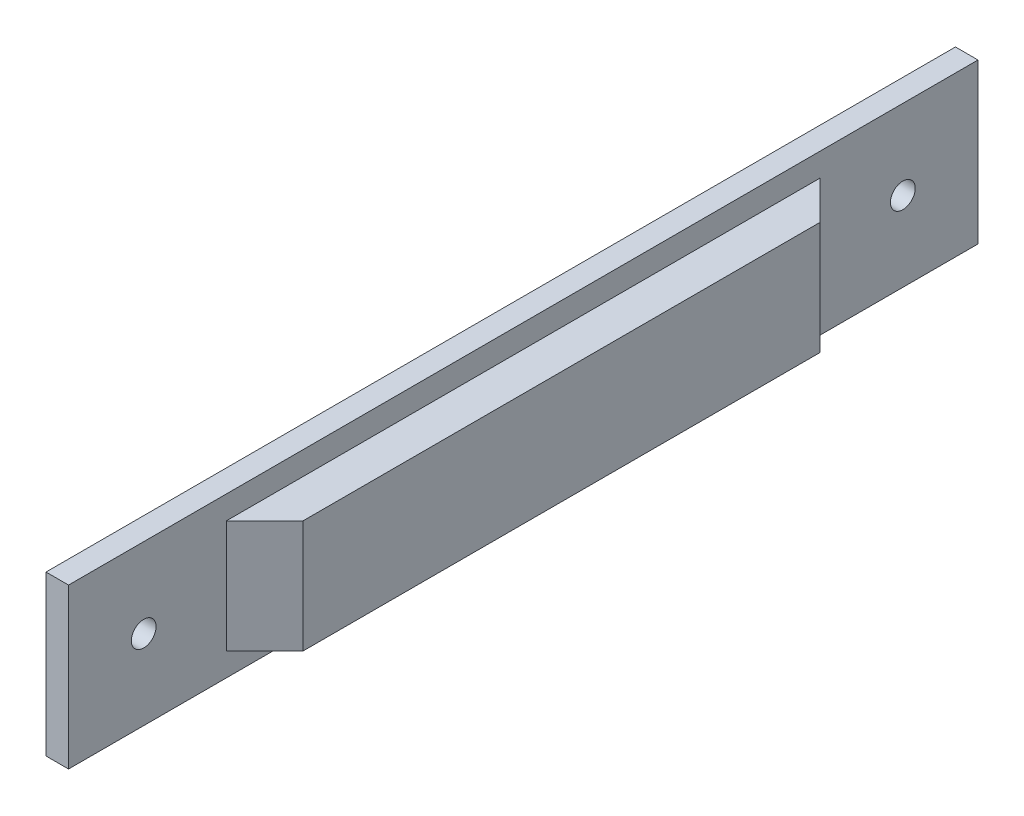
ISO-10303-21;
HEADER;
FILE_DESCRIPTION(('STEP AP214'),'2;1');
FILE_NAME('part.step','',(''),(''),'','','');
FILE_SCHEMA(('AUTOMOTIVE_DESIGN { 1 0 10303 214 1 1 1 1 }'));
ENDSEC;
DATA;
#1=APPLICATION_CONTEXT('core data for automotive mechanical design processes');
#2=APPLICATION_PROTOCOL_DEFINITION('international standard','automotive_design',2000,#1);
#3=PRODUCT_CONTEXT('',#1,'mechanical');
#4=PRODUCT('Part','Part','',(#3));
#5=PRODUCT_RELATED_PRODUCT_CATEGORY('part','',(#4));
#6=PRODUCT_DEFINITION_FORMATION('','',#4);
#7=PRODUCT_DEFINITION_CONTEXT('part definition',#1,'design');
#8=PRODUCT_DEFINITION('design','',#6,#7);
#9=PRODUCT_DEFINITION_SHAPE('','',#8);
#10=(LENGTH_UNIT() NAMED_UNIT(*) SI_UNIT(.MILLI.,.METRE.));
#11=(NAMED_UNIT(*) PLANE_ANGLE_UNIT() SI_UNIT($,.RADIAN.));
#12=(NAMED_UNIT(*) SI_UNIT($,.STERADIAN.) SOLID_ANGLE_UNIT());
#13=UNCERTAINTY_MEASURE_WITH_UNIT(LENGTH_MEASURE(1.E-05),#10,'distance_accuracy_value','');
#14=(GEOMETRIC_REPRESENTATION_CONTEXT(3) GLOBAL_UNCERTAINTY_ASSIGNED_CONTEXT((#13)) GLOBAL_UNIT_ASSIGNED_CONTEXT((#10,
#11,#12)) REPRESENTATION_CONTEXT('',''));
#15=CARTESIAN_POINT('',(0.,0.,0.));
#16=DIRECTION('',(0.,0.,1.));
#17=DIRECTION('',(1.,0.,0.));
#18=AXIS2_PLACEMENT_3D('',#15,#16,#17);
#19=CARTESIAN_POINT('',(0.,0.,121.));
#20=DIRECTION('',(1.,0.,0.));
#21=DIRECTION('',(0.,0.,-1.));
#22=AXIS2_PLACEMENT_3D('',#19,#20,#21);
#23=PLANE('',#22);
#24=CARTESIAN_POINT('',(0.,7.6,10.));
#25=DIRECTION('',(1.,0.,0.));
#26=DIRECTION('',(0.,0.,-1.));
#27=AXIS2_PLACEMENT_3D('',#24,#25,#26);
#28=CIRCLE('',#27,1.65);
#29=CARTESIAN_POINT('',(0.,7.6,11.65));
#30=VERTEX_POINT('',#29);
#31=EDGE_CURVE('E167',#30,#30,#28,.T.);
#32=ORIENTED_EDGE('',*,*,#31,.F.);
#33=EDGE_LOOP('',(#32));
#34=FACE_BOUND('',#33,.T.);
#35=CARTESIAN_POINT('',(0.,7.6,111.));
#36=DIRECTION('',(1.,0.,0.));
#37=DIRECTION('',(0.,0.,-1.));
#38=AXIS2_PLACEMENT_3D('',#35,#36,#37);
#39=CIRCLE('',#38,1.64999999999999);
#40=CARTESIAN_POINT('',(0.,7.6,112.65));
#41=VERTEX_POINT('',#40);
#42=EDGE_CURVE('E162',#41,#41,#39,.T.);
#43=ORIENTED_EDGE('',*,*,#42,.F.);
#44=EDGE_LOOP('',(#43));
#45=FACE_BOUND('',#44,.T.);
#46=DIRECTION('',(0.,-1.,0.));
#47=VECTOR('',#46,1.);
#48=CARTESIAN_POINT('',(0.,0.,0.));
#49=LINE('',#48,#47);
#50=CARTESIAN_POINT('',(0.,18.2,0.));
#51=VERTEX_POINT('',#50);
#52=CARTESIAN_POINT('',(0.,-3.,0.));
#53=VERTEX_POINT('',#52);
#54=EDGE_CURVE('E170',#51,#53,#49,.T.);
#55=ORIENTED_EDGE('',*,*,#54,.F.);
#56=DIRECTION('',(0.,0.,1.));
#57=VECTOR('',#56,1.);
#58=CARTESIAN_POINT('',(0.,18.2,121.));
#59=LINE('',#58,#57);
#60=CARTESIAN_POINT('',(0.,18.2,121.));
#61=VERTEX_POINT('',#60);
#62=EDGE_CURVE('E155',#51,#61,#59,.T.);
#63=ORIENTED_EDGE('',*,*,#62,.T.);
#64=DIRECTION('',(0.,-1.,0.));
#65=VECTOR('',#64,1.);
#66=CARTESIAN_POINT('',(0.,0.,121.));
#67=LINE('',#66,#65);
#68=CARTESIAN_POINT('',(0.,-3.,121.));
#69=VERTEX_POINT('',#68);
#70=EDGE_CURVE('E171',#61,#69,#67,.T.);
#71=ORIENTED_EDGE('',*,*,#70,.T.);
#72=DIRECTION('',(0.,0.,-1.));
#73=VECTOR('',#72,1.);
#74=CARTESIAN_POINT('',(0.,-3.,121.));
#75=LINE('',#74,#73);
#76=EDGE_CURVE('E151',#69,#53,#75,.T.);
#77=ORIENTED_EDGE('',*,*,#76,.T.);
#78=EDGE_LOOP('',(#55,#63,#71,#77));
#79=FACE_BOUND('',#78,.T.);
#80=DIRECTION('',(0.,0.,1.));
#81=VECTOR('',#80,1.);
#82=CARTESIAN_POINT('',(0.,15.1,94.9));
#83=LINE('',#82,#81);
#84=CARTESIAN_POINT('',(0.,15.1,21.));
#85=VERTEX_POINT('',#84);
#86=CARTESIAN_POINT('',(0.,15.1,100.));
#87=VERTEX_POINT('',#86);
#88=EDGE_CURVE('E78',#85,#87,#83,.T.);
#89=ORIENTED_EDGE('',*,*,#88,.F.);
#90=DIRECTION('',(0.,-1.,0.));
#91=VECTOR('',#90,1.);
#92=CARTESIAN_POINT('',(0.,0.,21.));
#93=LINE('',#92,#91);
#94=CARTESIAN_POINT('',(0.,0.100000000000025,21.));
#95=VERTEX_POINT('',#94);
#96=EDGE_CURVE('E197',#85,#95,#93,.T.);
#97=ORIENTED_EDGE('',*,*,#96,.T.);
#98=DIRECTION('',(0.,0.,-1.));
#99=VECTOR('',#98,1.);
#100=CARTESIAN_POINT('',(0.,0.0999999999999803,94.9));
#101=LINE('',#100,#99);
#102=CARTESIAN_POINT('',(0.,0.0999999999999772,100.));
#103=VERTEX_POINT('',#102);
#104=EDGE_CURVE('E86',#103,#95,#101,.T.);
#105=ORIENTED_EDGE('',*,*,#104,.F.);
#106=DIRECTION('',(0.,1.,0.));
#107=VECTOR('',#106,1.);
#108=CARTESIAN_POINT('',(0.,0.,100.));
#109=LINE('',#108,#107);
#110=EDGE_CURVE('E131',#103,#87,#109,.T.);
#111=ORIENTED_EDGE('',*,*,#110,.T.);
#112=EDGE_LOOP('',(#89,#97,#105,#111));
#113=FACE_BOUND('',#112,.T.);
#114=ADVANCED_FACE('F62',(#34,#45,#79,#113),#23,.T.);
#115=CARTESIAN_POINT('',(0.,0.,121.));
#116=DIRECTION('',(0.,0.,1.));
#117=DIRECTION('',(1.,0.,0.));
#118=AXIS2_PLACEMENT_3D('',#115,#116,#117);
#119=PLANE('',#118);
#120=DIRECTION('',(1.,0.,0.));
#121=VECTOR('',#120,1.);
#122=CARTESIAN_POINT('',(0.,-3.,121.));
#123=LINE('',#122,#121);
#124=CARTESIAN_POINT('',(-3.,-3.,121.));
#125=VERTEX_POINT('',#124);
#126=EDGE_CURVE('E178',#125,#69,#123,.T.);
#127=ORIENTED_EDGE('',*,*,#126,.T.);
#128=ORIENTED_EDGE('',*,*,#70,.F.);
#129=DIRECTION('',(-1.,0.,0.));
#130=VECTOR('',#129,1.);
#131=CARTESIAN_POINT('',(0.,18.2,121.));
#132=LINE('',#131,#130);
#133=CARTESIAN_POINT('',(-3.,18.2,121.));
#134=VERTEX_POINT('',#133);
#135=EDGE_CURVE('E182',#61,#134,#132,.T.);
#136=ORIENTED_EDGE('',*,*,#135,.T.);
#137=DIRECTION('',(0.,-1.,0.));
#138=VECTOR('',#137,1.);
#139=CARTESIAN_POINT('',(-3.,0.,121.));
#140=LINE('',#139,#138);
#141=EDGE_CURVE('E175',#134,#125,#140,.T.);
#142=ORIENTED_EDGE('',*,*,#141,.T.);
#143=EDGE_LOOP('',(#127,#128,#136,#142));
#144=FACE_BOUND('',#143,.T.);
#145=ADVANCED_FACE('F207',(#144),#119,.T.);
#146=CARTESIAN_POINT('',(0.,0.,0.));
#147=DIRECTION('',(0.,0.,1.));
#148=DIRECTION('',(1.,0.,0.));
#149=AXIS2_PLACEMENT_3D('',#146,#147,#148);
#150=PLANE('',#149);
#151=ORIENTED_EDGE('',*,*,#54,.T.);
#152=DIRECTION('',(1.,0.,0.));
#153=VECTOR('',#152,1.);
#154=CARTESIAN_POINT('',(0.,-3.,0.));
#155=LINE('',#154,#153);
#156=CARTESIAN_POINT('',(-3.,-3.,0.));
#157=VERTEX_POINT('',#156);
#158=EDGE_CURVE('E187',#157,#53,#155,.T.);
#159=ORIENTED_EDGE('',*,*,#158,.F.);
#160=DIRECTION('',(0.,-1.,0.));
#161=VECTOR('',#160,1.);
#162=CARTESIAN_POINT('',(-3.,0.,0.));
#163=LINE('',#162,#161);
#164=CARTESIAN_POINT('',(-3.,18.2,0.));
#165=VERTEX_POINT('',#164);
#166=EDGE_CURVE('E173',#165,#157,#163,.T.);
#167=ORIENTED_EDGE('',*,*,#166,.F.);
#168=DIRECTION('',(-1.,0.,0.));
#169=VECTOR('',#168,1.);
#170=CARTESIAN_POINT('',(0.,18.2,0.));
#171=LINE('',#170,#169);
#172=EDGE_CURVE('E179',#51,#165,#171,.T.);
#173=ORIENTED_EDGE('',*,*,#172,.F.);
#174=EDGE_LOOP('',(#151,#159,#167,#173));
#175=FACE_BOUND('',#174,.T.);
#176=ADVANCED_FACE('F213',(#175),#150,.F.);
#177=CARTESIAN_POINT('',(0.,-3.,121.));
#178=DIRECTION('',(0.,1.,0.));
#179=DIRECTION('',(0.,0.,1.));
#180=AXIS2_PLACEMENT_3D('',#177,#178,#179);
#181=PLANE('',#180);
#182=ORIENTED_EDGE('',*,*,#76,.F.);
#183=ORIENTED_EDGE('',*,*,#126,.F.);
#184=DIRECTION('',(0.,0.,-1.));
#185=VECTOR('',#184,1.);
#186=CARTESIAN_POINT('',(-3.,-3.,121.));
#187=LINE('',#186,#185);
#188=EDGE_CURVE('E193',#125,#157,#187,.T.);
#189=ORIENTED_EDGE('',*,*,#188,.T.);
#190=ORIENTED_EDGE('',*,*,#158,.T.);
#191=EDGE_LOOP('',(#182,#183,#189,#190));
#192=FACE_BOUND('',#191,.T.);
#193=ADVANCED_FACE('F224',(#192),#181,.F.);
#194=CARTESIAN_POINT('',(0.,18.2,121.));
#195=DIRECTION('',(0.,-1.,0.));
#196=DIRECTION('',(0.,0.,-1.));
#197=AXIS2_PLACEMENT_3D('',#194,#195,#196);
#198=PLANE('',#197);
#199=ORIENTED_EDGE('',*,*,#62,.F.);
#200=ORIENTED_EDGE('',*,*,#172,.T.);
#201=DIRECTION('',(0.,0.,-1.));
#202=VECTOR('',#201,1.);
#203=CARTESIAN_POINT('',(-3.,18.2,121.));
#204=LINE('',#203,#202);
#205=EDGE_CURVE('E184',#134,#165,#204,.T.);
#206=ORIENTED_EDGE('',*,*,#205,.F.);
#207=ORIENTED_EDGE('',*,*,#135,.F.);
#208=EDGE_LOOP('',(#199,#200,#206,#207));
#209=FACE_BOUND('',#208,.T.);
#210=ADVANCED_FACE('F226',(#209),#198,.F.);
#211=CARTESIAN_POINT('',(-3.,0.,121.));
#212=DIRECTION('',(1.,0.,0.));
#213=DIRECTION('',(0.,0.,-1.));
#214=AXIS2_PLACEMENT_3D('',#211,#212,#213);
#215=PLANE('',#214);
#216=CARTESIAN_POINT('',(-3.,7.6,10.));
#217=DIRECTION('',(-1.,0.,0.));
#218=DIRECTION('',(0.,0.,1.));
#219=AXIS2_PLACEMENT_3D('',#216,#217,#218);
#220=CIRCLE('',#219,1.65);
#221=CARTESIAN_POINT('',(-3.,7.6,11.65));
#222=VERTEX_POINT('',#221);
#223=EDGE_CURVE('E159',#222,#222,#220,.T.);
#224=ORIENTED_EDGE('',*,*,#223,.F.);
#225=EDGE_LOOP('',(#224));
#226=FACE_BOUND('',#225,.T.);
#227=CARTESIAN_POINT('',(-3.,7.6,111.));
#228=DIRECTION('',(-1.,0.,0.));
#229=DIRECTION('',(0.,0.,1.));
#230=AXIS2_PLACEMENT_3D('',#227,#228,#229);
#231=CIRCLE('',#230,1.64999999999999);
#232=CARTESIAN_POINT('',(-3.,7.6,112.65));
#233=VERTEX_POINT('',#232);
#234=EDGE_CURVE('E158',#233,#233,#231,.T.);
#235=ORIENTED_EDGE('',*,*,#234,.F.);
#236=EDGE_LOOP('',(#235));
#237=FACE_BOUND('',#236,.T.);
#238=ORIENTED_EDGE('',*,*,#166,.T.);
#239=ORIENTED_EDGE('',*,*,#188,.F.);
#240=ORIENTED_EDGE('',*,*,#141,.F.);
#241=ORIENTED_EDGE('',*,*,#205,.T.);
#242=EDGE_LOOP('',(#238,#239,#240,#241));
#243=FACE_BOUND('',#242,.T.);
#244=ADVANCED_FACE('F229',(#226,#237,#243),#215,.F.);
#245=CARTESIAN_POINT('',(27.,7.6,111.));
#246=DIRECTION('',(-1.,0.,0.));
#247=DIRECTION('',(0.,0.,1.));
#248=AXIS2_PLACEMENT_3D('',#245,#246,#247);
#249=CYLINDRICAL_SURFACE('',#248,1.64999999999999);
#250=CARTESIAN_POINT('',(0.,7.6,112.65));
#251=CARTESIAN_POINT('',(-0.0312500000000035,7.6,112.65));
#252=CARTESIAN_POINT('',(-0.0625000000000035,7.6,112.65));
#253=CARTESIAN_POINT('',(-0.125000000000004,7.6,112.65));
#254=CARTESIAN_POINT('',(-0.156250000000004,7.6,112.65));
#255=CARTESIAN_POINT('',(-0.218750000000004,7.6,112.65));
#256=CARTESIAN_POINT('',(-0.250000000000004,7.6,112.65));
#257=CARTESIAN_POINT('',(-0.312500000000004,7.6,112.65));
#258=CARTESIAN_POINT('',(-0.343750000000004,7.6,112.65));
#259=CARTESIAN_POINT('',(-0.406250000000004,7.6,112.65));
#260=CARTESIAN_POINT('',(-0.437500000000004,7.6,112.65));
#261=CARTESIAN_POINT('',(-0.500000000000004,7.6,112.65));
#262=CARTESIAN_POINT('',(-0.531250000000004,7.6,112.65));
#263=CARTESIAN_POINT('',(-0.593750000000004,7.6,112.65));
#264=CARTESIAN_POINT('',(-0.625000000000004,7.6,112.65));
#265=CARTESIAN_POINT('',(-0.687500000000004,7.6,112.65));
#266=CARTESIAN_POINT('',(-0.718750000000004,7.6,112.65));
#267=CARTESIAN_POINT('',(-0.781250000000003,7.6,112.65));
#268=CARTESIAN_POINT('',(-0.812500000000002,7.6,112.65));
#269=CARTESIAN_POINT('',(-0.875000000000001,7.6,112.65));
#270=CARTESIAN_POINT('',(-0.906250000000001,7.6,112.65));
#271=CARTESIAN_POINT('',(-0.968750000000001,7.6,112.65));
#272=CARTESIAN_POINT('',(-1.,7.6,112.65));
#273=CARTESIAN_POINT('',(-1.0625,7.6,112.65));
#274=CARTESIAN_POINT('',(-1.09375,7.6,112.65));
#275=CARTESIAN_POINT('',(-1.15625,7.6,112.65));
#276=CARTESIAN_POINT('',(-1.1875,7.6,112.65));
#277=CARTESIAN_POINT('',(-1.25,7.6,112.65));
#278=CARTESIAN_POINT('',(-1.28125,7.6,112.65));
#279=CARTESIAN_POINT('',(-1.34375,7.6,112.65));
#280=CARTESIAN_POINT('',(-1.375,7.6,112.65));
#281=CARTESIAN_POINT('',(-1.4375,7.6,112.65));
#282=CARTESIAN_POINT('',(-1.46875,7.6,112.65));
#283=CARTESIAN_POINT('',(-1.53125,7.6,112.65));
#284=CARTESIAN_POINT('',(-1.5625,7.6,112.65));
#285=CARTESIAN_POINT('',(-1.625,7.6,112.65));
#286=CARTESIAN_POINT('',(-1.65625,7.6,112.65));
#287=CARTESIAN_POINT('',(-1.71875,7.6,112.65));
#288=CARTESIAN_POINT('',(-1.75,7.6,112.65));
#289=CARTESIAN_POINT('',(-1.8125,7.6,112.65));
#290=CARTESIAN_POINT('',(-1.84375,7.6,112.65));
#291=CARTESIAN_POINT('',(-1.90625,7.6,112.65));
#292=CARTESIAN_POINT('',(-1.9375,7.6,112.65));
#293=CARTESIAN_POINT('',(-2.,7.6,112.65));
#294=CARTESIAN_POINT('',(-2.03125,7.6,112.65));
#295=CARTESIAN_POINT('',(-2.09375,7.6,112.65));
#296=CARTESIAN_POINT('',(-2.125,7.6,112.65));
#297=CARTESIAN_POINT('',(-2.1875,7.6,112.65));
#298=CARTESIAN_POINT('',(-2.21875,7.6,112.65));
#299=CARTESIAN_POINT('',(-2.28125,7.6,112.65));
#300=CARTESIAN_POINT('',(-2.3125,7.6,112.65));
#301=CARTESIAN_POINT('',(-2.375,7.6,112.65));
#302=CARTESIAN_POINT('',(-2.40625,7.6,112.65));
#303=CARTESIAN_POINT('',(-2.46875,7.6,112.65));
#304=CARTESIAN_POINT('',(-2.5,7.6,112.65));
#305=CARTESIAN_POINT('',(-2.5625,7.6,112.65));
#306=CARTESIAN_POINT('',(-2.59375,7.6,112.65));
#307=CARTESIAN_POINT('',(-2.65625,7.6,112.65));
#308=CARTESIAN_POINT('',(-2.6875,7.6,112.65));
#309=CARTESIAN_POINT('',(-2.75,7.6,112.65));
#310=CARTESIAN_POINT('',(-2.78125,7.6,112.65));
#311=CARTESIAN_POINT('',(-2.84375,7.6,112.65));
#312=CARTESIAN_POINT('',(-2.875,7.6,112.65));
#313=CARTESIAN_POINT('',(-2.9375,7.6,112.65));
#314=CARTESIAN_POINT('',(-2.96875,7.6,112.65));
#315=CARTESIAN_POINT('',(-3.,7.6,112.65));
#316=B_SPLINE_CURVE_WITH_KNOTS('',3,(#250,#251,#252,#253,#254,#255,#256,#257,#258,#259,#260,
#261,#262,#263,#264,#265,#266,#267,#268,#269,#270,#271,#272,#273,#274,#275,#276,#277,#278,#279,
#280,#281,#282,#283,#284,#285,#286,#287,#288,#289,#290,#291,#292,#293,#294,#295,#296,#297,#298,
#299,#300,#301,#302,#303,#304,#305,#306,#307,#308,#309,#310,#311,#312,#313,#314,#315),
.UNSPECIFIED.,.F.,.F.,(4,2,2,2,2,2,2,2,2,2,2,2,2,2,2,2,2,2,2,2,2,2,2,2,2,2,2,2,2,2,2,2,4),(0.,
0.0937500000000001,0.1875,0.28125,0.375,0.46875,0.5625,0.656250000000001,0.750000000000001,
0.843749999999997,0.937499999999997,1.03125,1.125,1.21875,1.3125,1.40625,1.5,1.59375,1.6875,
1.78125,1.875,1.96875,2.0625,2.15625,2.25,2.34375,2.4375,2.53125,2.625,2.71875,2.8125,2.90625,
3.),.UNSPECIFIED.);
#317=EDGE_CURVE('BSEAM219',#41,#233,#316,.T.);
#318=ORIENTED_EDGE('',*,*,#42,.T.);
#319=ORIENTED_EDGE('',*,*,#234,.T.);
#320=ORIENTED_EDGE('',*,*,#317,.T.);
#321=ORIENTED_EDGE('',*,*,#317,.F.);
#322=EDGE_LOOP('',(#318,#320,#319,#321));
#323=FACE_BOUND('',#322,.T.);
#324=ADVANCED_FACE('F219',(#323),#249,.F.);
#325=CARTESIAN_POINT('',(27.,7.6,10.));
#326=DIRECTION('',(-1.,0.,0.));
#327=DIRECTION('',(0.,0.,1.));
#328=AXIS2_PLACEMENT_3D('',#325,#326,#327);
#329=CYLINDRICAL_SURFACE('',#328,1.65);
#330=CARTESIAN_POINT('',(0.,7.6,11.65));
#331=CARTESIAN_POINT('',(-0.0312500000000035,7.6,11.65));
#332=CARTESIAN_POINT('',(-0.0625000000000035,7.6,11.65));
#333=CARTESIAN_POINT('',(-0.125000000000004,7.6,11.65));
#334=CARTESIAN_POINT('',(-0.156250000000004,7.6,11.65));
#335=CARTESIAN_POINT('',(-0.218750000000004,7.6,11.65));
#336=CARTESIAN_POINT('',(-0.250000000000004,7.6,11.65));
#337=CARTESIAN_POINT('',(-0.312500000000004,7.6,11.65));
#338=CARTESIAN_POINT('',(-0.343750000000004,7.6,11.65));
#339=CARTESIAN_POINT('',(-0.406250000000004,7.6,11.65));
#340=CARTESIAN_POINT('',(-0.437500000000004,7.6,11.65));
#341=CARTESIAN_POINT('',(-0.500000000000004,7.6,11.65));
#342=CARTESIAN_POINT('',(-0.531250000000004,7.6,11.65));
#343=CARTESIAN_POINT('',(-0.593750000000004,7.6,11.65));
#344=CARTESIAN_POINT('',(-0.625000000000004,7.6,11.65));
#345=CARTESIAN_POINT('',(-0.687500000000004,7.6,11.65));
#346=CARTESIAN_POINT('',(-0.718750000000004,7.6,11.65));
#347=CARTESIAN_POINT('',(-0.781250000000003,7.6,11.65));
#348=CARTESIAN_POINT('',(-0.812500000000002,7.6,11.65));
#349=CARTESIAN_POINT('',(-0.875000000000001,7.6,11.65));
#350=CARTESIAN_POINT('',(-0.906250000000001,7.6,11.65));
#351=CARTESIAN_POINT('',(-0.968750000000001,7.6,11.65));
#352=CARTESIAN_POINT('',(-1.,7.6,11.65));
#353=CARTESIAN_POINT('',(-1.0625,7.6,11.65));
#354=CARTESIAN_POINT('',(-1.09375,7.6,11.65));
#355=CARTESIAN_POINT('',(-1.15625,7.6,11.65));
#356=CARTESIAN_POINT('',(-1.1875,7.6,11.65));
#357=CARTESIAN_POINT('',(-1.25,7.6,11.65));
#358=CARTESIAN_POINT('',(-1.28125,7.6,11.65));
#359=CARTESIAN_POINT('',(-1.34375,7.6,11.65));
#360=CARTESIAN_POINT('',(-1.375,7.6,11.65));
#361=CARTESIAN_POINT('',(-1.4375,7.6,11.65));
#362=CARTESIAN_POINT('',(-1.46875,7.6,11.65));
#363=CARTESIAN_POINT('',(-1.53125,7.6,11.65));
#364=CARTESIAN_POINT('',(-1.5625,7.6,11.65));
#365=CARTESIAN_POINT('',(-1.625,7.6,11.65));
#366=CARTESIAN_POINT('',(-1.65625,7.6,11.65));
#367=CARTESIAN_POINT('',(-1.71875,7.6,11.65));
#368=CARTESIAN_POINT('',(-1.75,7.6,11.65));
#369=CARTESIAN_POINT('',(-1.8125,7.6,11.65));
#370=CARTESIAN_POINT('',(-1.84375,7.6,11.65));
#371=CARTESIAN_POINT('',(-1.90625,7.6,11.65));
#372=CARTESIAN_POINT('',(-1.9375,7.6,11.65));
#373=CARTESIAN_POINT('',(-2.,7.6,11.65));
#374=CARTESIAN_POINT('',(-2.03125,7.6,11.65));
#375=CARTESIAN_POINT('',(-2.09375,7.6,11.65));
#376=CARTESIAN_POINT('',(-2.125,7.6,11.65));
#377=CARTESIAN_POINT('',(-2.1875,7.6,11.65));
#378=CARTESIAN_POINT('',(-2.21875,7.6,11.65));
#379=CARTESIAN_POINT('',(-2.28125,7.6,11.65));
#380=CARTESIAN_POINT('',(-2.3125,7.6,11.65));
#381=CARTESIAN_POINT('',(-2.375,7.6,11.65));
#382=CARTESIAN_POINT('',(-2.40625,7.6,11.65));
#383=CARTESIAN_POINT('',(-2.46875,7.6,11.65));
#384=CARTESIAN_POINT('',(-2.5,7.6,11.65));
#385=CARTESIAN_POINT('',(-2.5625,7.6,11.65));
#386=CARTESIAN_POINT('',(-2.59375,7.6,11.65));
#387=CARTESIAN_POINT('',(-2.65625,7.6,11.65));
#388=CARTESIAN_POINT('',(-2.6875,7.6,11.65));
#389=CARTESIAN_POINT('',(-2.75,7.6,11.65));
#390=CARTESIAN_POINT('',(-2.78125,7.6,11.65));
#391=CARTESIAN_POINT('',(-2.84375,7.6,11.65));
#392=CARTESIAN_POINT('',(-2.875,7.6,11.65));
#393=CARTESIAN_POINT('',(-2.9375,7.6,11.65));
#394=CARTESIAN_POINT('',(-2.96875,7.6,11.65));
#395=CARTESIAN_POINT('',(-3.,7.6,11.65));
#396=B_SPLINE_CURVE_WITH_KNOTS('',3,(#330,#331,#332,#333,#334,#335,#336,#337,#338,#339,#340,
#341,#342,#343,#344,#345,#346,#347,#348,#349,#350,#351,#352,#353,#354,#355,#356,#357,#358,#359,
#360,#361,#362,#363,#364,#365,#366,#367,#368,#369,#370,#371,#372,#373,#374,#375,#376,#377,#378,
#379,#380,#381,#382,#383,#384,#385,#386,#387,#388,#389,#390,#391,#392,#393,#394,#395),
.UNSPECIFIED.,.F.,.F.,(4,2,2,2,2,2,2,2,2,2,2,2,2,2,2,2,2,2,2,2,2,2,2,2,2,2,2,2,2,2,2,2,4),(0.,
0.0937500000000001,0.1875,0.28125,0.375,0.46875,0.5625,0.656250000000001,0.750000000000001,
0.843749999999997,0.937499999999997,1.03125,1.125,1.21875,1.3125,1.40625,1.5,1.59375,1.6875,
1.78125,1.875,1.96875,2.0625,2.15625,2.25,2.34375,2.4375,2.53125,2.625,2.71875,2.8125,2.90625,
3.),.UNSPECIFIED.);
#397=EDGE_CURVE('BSEAM251',#30,#222,#396,.T.);
#398=ORIENTED_EDGE('',*,*,#31,.T.);
#399=ORIENTED_EDGE('',*,*,#223,.T.);
#400=ORIENTED_EDGE('',*,*,#397,.T.);
#401=ORIENTED_EDGE('',*,*,#397,.F.);
#402=EDGE_LOOP('',(#398,#400,#399,#401));
#403=FACE_BOUND('',#402,.T.);
#404=ADVANCED_FACE('F251',(#403),#329,.F.);
#405=CARTESIAN_POINT('',(5.1,0.0999999999999803,94.9));
#406=DIRECTION('',(0.,1.,0.));
#407=DIRECTION('',(0.,0.,1.));
#408=AXIS2_PLACEMENT_3D('',#405,#406,#407);
#409=PLANE('',#408);
#410=ORIENTED_EDGE('',*,*,#104,.T.);
#411=DIRECTION('',(0.707106781186549,0.,0.707106781186546));
#412=VECTOR('',#411,1.);
#413=CARTESIAN_POINT('',(39.5,0.100000000000001,60.4999999999999));
#414=LINE('',#413,#412);
#415=CARTESIAN_POINT('',(5.1,0.100000000000022,26.1));
#416=VERTEX_POINT('',#415);
#417=EDGE_CURVE('E132',#95,#416,#414,.T.);
#418=ORIENTED_EDGE('',*,*,#417,.T.);
#419=DIRECTION('',(0.,0.,-1.));
#420=VECTOR('',#419,1.);
#421=CARTESIAN_POINT('',(5.1,0.0999999999999803,94.9));
#422=LINE('',#421,#420);
#423=CARTESIAN_POINT('',(5.1,0.0999999999999803,94.9));
#424=VERTEX_POINT('',#423);
#425=EDGE_CURVE('E134',#424,#416,#422,.T.);
#426=ORIENTED_EDGE('',*,*,#425,.F.);
#427=DIRECTION('',(-0.707106781186549,0.,0.707106781186546));
#428=VECTOR('',#427,1.);
#429=CARTESIAN_POINT('',(5.1,0.0999999999999803,94.9));
#430=LINE('',#429,#428);
#431=EDGE_CURVE('E71',#424,#103,#430,.T.);
#432=ORIENTED_EDGE('',*,*,#431,.T.);
#433=EDGE_LOOP('',(#410,#418,#426,#432));
#434=FACE_BOUND('',#433,.T.);
#435=ADVANCED_FACE('F135',(#434),#409,.F.);
#436=CARTESIAN_POINT('',(5.1,15.1,94.9));
#437=DIRECTION('',(0.,-1.,0.));
#438=DIRECTION('',(0.,0.,-1.));
#439=AXIS2_PLACEMENT_3D('',#436,#437,#438);
#440=PLANE('',#439);
#441=ORIENTED_EDGE('',*,*,#88,.T.);
#442=DIRECTION('',(0.707106781186549,0.,-0.707106781186546));
#443=VECTOR('',#442,1.);
#444=CARTESIAN_POINT('',(5.1,15.1,94.9));
#445=LINE('',#444,#443);
#446=CARTESIAN_POINT('',(5.1,15.1,94.9));
#447=VERTEX_POINT('',#446);
#448=EDGE_CURVE('E12',#87,#447,#445,.T.);
#449=ORIENTED_EDGE('',*,*,#448,.T.);
#450=DIRECTION('',(0.,0.,1.));
#451=VECTOR('',#450,1.);
#452=CARTESIAN_POINT('',(5.1,15.1,94.9));
#453=LINE('',#452,#451);
#454=CARTESIAN_POINT('',(5.1,15.1,26.1));
#455=VERTEX_POINT('',#454);
#456=EDGE_CURVE('E145',#455,#447,#453,.T.);
#457=ORIENTED_EDGE('',*,*,#456,.F.);
#458=DIRECTION('',(-0.707106781186549,0.,-0.707106781186546));
#459=VECTOR('',#458,1.);
#460=CARTESIAN_POINT('',(39.5,15.1,60.4999999999999));
#461=LINE('',#460,#459);
#462=EDGE_CURVE('E199',#455,#85,#461,.T.);
#463=ORIENTED_EDGE('',*,*,#462,.T.);
#464=EDGE_LOOP('',(#441,#449,#457,#463));
#465=FACE_BOUND('',#464,.T.);
#466=ADVANCED_FACE('F203',(#465),#440,.F.);
#467=CARTESIAN_POINT('',(5.1,0.,0.));
#468=DIRECTION('',(1.,0.,0.));
#469=DIRECTION('',(0.,0.,-1.));
#470=AXIS2_PLACEMENT_3D('',#467,#468,#469);
#471=PLANE('',#470);
#472=DIRECTION('',(0.,-1.,0.));
#473=VECTOR('',#472,1.);
#474=CARTESIAN_POINT('',(5.1,15.1,94.9));
#475=LINE('',#474,#473);
#476=EDGE_CURVE('E130',#447,#424,#475,.T.);
#477=ORIENTED_EDGE('',*,*,#476,.T.);
#478=ORIENTED_EDGE('',*,*,#425,.T.);
#479=DIRECTION('',(0.,1.,0.));
#480=VECTOR('',#479,1.);
#481=CARTESIAN_POINT('',(5.1,15.1,26.1));
#482=LINE('',#481,#480);
#483=EDGE_CURVE('E140',#416,#455,#482,.T.);
#484=ORIENTED_EDGE('',*,*,#483,.T.);
#485=ORIENTED_EDGE('',*,*,#456,.T.);
#486=EDGE_LOOP('',(#477,#478,#484,#485));
#487=FACE_BOUND('',#486,.T.);
#488=ADVANCED_FACE('F143',(#487),#471,.T.);
#489=CARTESIAN_POINT('',(5.1,15.1,26.1));
#490=DIRECTION('',(-0.707106781186546,0.,0.707106781186549));
#491=DIRECTION('',(0.,1.,0.));
#492=AXIS2_PLACEMENT_3D('',#489,#490,#491);
#493=PLANE('',#492);
#494=ORIENTED_EDGE('',*,*,#417,.F.);
#495=ORIENTED_EDGE('',*,*,#96,.F.);
#496=ORIENTED_EDGE('',*,*,#462,.F.);
#497=ORIENTED_EDGE('',*,*,#483,.F.);
#498=EDGE_LOOP('',(#494,#495,#496,#497));
#499=FACE_BOUND('',#498,.T.);
#500=ADVANCED_FACE('F205',(#499),#493,.F.);
#501=CARTESIAN_POINT('',(5.1,15.1,94.9));
#502=DIRECTION('',(-0.707106781186546,0.,-0.707106781186549));
#503=DIRECTION('',(0.,-1.,0.));
#504=AXIS2_PLACEMENT_3D('',#501,#502,#503);
#505=PLANE('',#504);
#506=ORIENTED_EDGE('',*,*,#448,.F.);
#507=ORIENTED_EDGE('',*,*,#110,.F.);
#508=ORIENTED_EDGE('',*,*,#431,.F.);
#509=ORIENTED_EDGE('',*,*,#476,.F.);
#510=EDGE_LOOP('',(#506,#507,#508,#509));
#511=FACE_BOUND('',#510,.T.);
#512=ADVANCED_FACE('F65',(#511),#505,.F.);
#513=CLOSED_SHELL('',(#114,#145,#176,#193,#210,#244,#324,#404,#435,#466,#488,#500,#512));
#514=MANIFOLD_SOLID_BREP('B2',#513);
#515=ADVANCED_BREP_SHAPE_REPRESENTATION('',(#18,#514),#14);
#516=SHAPE_DEFINITION_REPRESENTATION(#9,#515);
ENDSEC;
END-ISO-10303-21;
